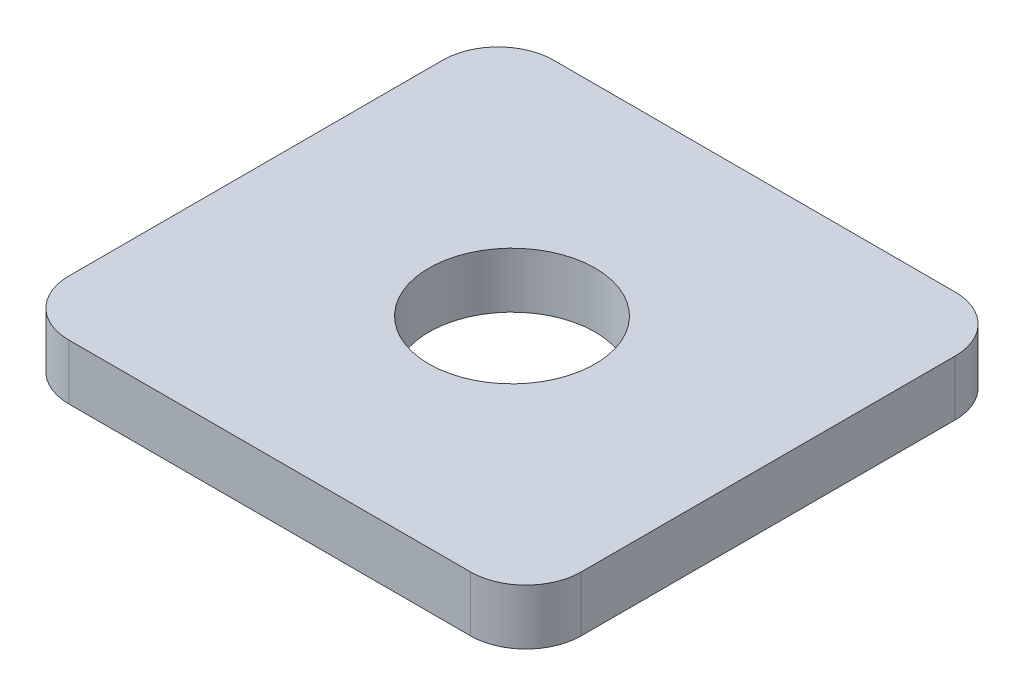
ISO-10303-21;
HEADER;
FILE_DESCRIPTION(('STEP AP214'),'2;1');
FILE_NAME('part.step','',(''),(''),'','','');
FILE_SCHEMA(('AUTOMOTIVE_DESIGN { 1 0 10303 214 1 1 1 1 }'));
ENDSEC;
DATA;
#1=APPLICATION_CONTEXT('core data for automotive mechanical design processes');
#2=APPLICATION_PROTOCOL_DEFINITION('international standard','automotive_design',2000,#1);
#3=PRODUCT_CONTEXT('',#1,'mechanical');
#4=PRODUCT('Part','Part','',(#3));
#5=PRODUCT_RELATED_PRODUCT_CATEGORY('part','',(#4));
#6=PRODUCT_DEFINITION_FORMATION('','',#4);
#7=PRODUCT_DEFINITION_CONTEXT('part definition',#1,'design');
#8=PRODUCT_DEFINITION('design','',#6,#7);
#9=PRODUCT_DEFINITION_SHAPE('','',#8);
#10=(LENGTH_UNIT() NAMED_UNIT(*) SI_UNIT(.MILLI.,.METRE.));
#11=(NAMED_UNIT(*) PLANE_ANGLE_UNIT() SI_UNIT($,.RADIAN.));
#12=(NAMED_UNIT(*) SI_UNIT($,.STERADIAN.) SOLID_ANGLE_UNIT());
#13=UNCERTAINTY_MEASURE_WITH_UNIT(LENGTH_MEASURE(1.E-05),#10,'distance_accuracy_value','');
#14=(GEOMETRIC_REPRESENTATION_CONTEXT(3) GLOBAL_UNCERTAINTY_ASSIGNED_CONTEXT((#13)) GLOBAL_UNIT_ASSIGNED_CONTEXT((#10,
#11,#12)) REPRESENTATION_CONTEXT('',''));
#15=CARTESIAN_POINT('',(0.,0.,0.));
#16=DIRECTION('',(0.,0.,1.));
#17=DIRECTION('',(1.,0.,0.));
#18=AXIS2_PLACEMENT_3D('',#15,#16,#17);
#19=CARTESIAN_POINT('',(9.25,2.,8.75));
#20=DIRECTION('',(-1.,0.,0.));
#21=DIRECTION('',(0.,0.,1.));
#22=AXIS2_PLACEMENT_3D('',#19,#20,#21);
#23=PLANE('',#22);
#24=DIRECTION('',(0.,0.,-1.));
#25=VECTOR('',#24,1.);
#26=CARTESIAN_POINT('',(9.25,0.,8.75));
#27=LINE('',#26,#25);
#28=CARTESIAN_POINT('',(9.25,0.,6.75));
#29=VERTEX_POINT('',#28);
#30=CARTESIAN_POINT('',(9.25,0.,-6.75));
#31=VERTEX_POINT('',#30);
#32=EDGE_CURVE('E141',#29,#31,#27,.T.);
#33=ORIENTED_EDGE('',*,*,#32,.T.);
#34=DIRECTION('',(0.,-1.,0.));
#35=VECTOR('',#34,1.);
#36=CARTESIAN_POINT('',(9.25,2.,-6.75));
#37=LINE('',#36,#35);
#38=CARTESIAN_POINT('',(9.25,2.,-6.75));
#39=VERTEX_POINT('',#38);
#40=EDGE_CURVE('E175',#31,#39,#37,.F.);
#41=ORIENTED_EDGE('',*,*,#40,.T.);
#42=DIRECTION('',(0.,0.,-1.));
#43=VECTOR('',#42,1.);
#44=CARTESIAN_POINT('',(9.25,2.,8.75));
#45=LINE('',#44,#43);
#46=CARTESIAN_POINT('',(9.25,2.,6.75));
#47=VERTEX_POINT('',#46);
#48=EDGE_CURVE('E139',#47,#39,#45,.T.);
#49=ORIENTED_EDGE('',*,*,#48,.F.);
#50=DIRECTION('',(0.,-1.,0.));
#51=VECTOR('',#50,1.);
#52=CARTESIAN_POINT('',(9.25,2.,6.75));
#53=LINE('',#52,#51);
#54=EDGE_CURVE('E171',#47,#29,#53,.T.);
#55=ORIENTED_EDGE('',*,*,#54,.T.);
#56=EDGE_LOOP('',(#33,#41,#49,#55));
#57=FACE_BOUND('',#56,.T.);
#58=ADVANCED_FACE('F39',(#57),#23,.F.);
#59=CARTESIAN_POINT('',(-9.25,2.,-8.75));
#60=DIRECTION('',(0.,0.,1.));
#61=DIRECTION('',(1.,0.,0.));
#62=AXIS2_PLACEMENT_3D('',#59,#60,#61);
#63=PLANE('',#62);
#64=DIRECTION('',(-1.,0.,0.));
#65=VECTOR('',#64,1.);
#66=CARTESIAN_POINT('',(-9.25,0.,-8.75));
#67=LINE('',#66,#65);
#68=CARTESIAN_POINT('',(7.25,0.,-8.75));
#69=VERTEX_POINT('',#68);
#70=CARTESIAN_POINT('',(-7.25,0.,-8.75));
#71=VERTEX_POINT('',#70);
#72=EDGE_CURVE('E135',#69,#71,#67,.T.);
#73=ORIENTED_EDGE('',*,*,#72,.T.);
#74=DIRECTION('',(0.,-1.,0.));
#75=VECTOR('',#74,1.);
#76=CARTESIAN_POINT('',(-7.25,2.,-8.75));
#77=LINE('',#76,#75);
#78=CARTESIAN_POINT('',(-7.25,2.,-8.75));
#79=VERTEX_POINT('',#78);
#80=EDGE_CURVE('E111',#71,#79,#77,.F.);
#81=ORIENTED_EDGE('',*,*,#80,.T.);
#82=DIRECTION('',(-1.,0.,0.));
#83=VECTOR('',#82,1.);
#84=CARTESIAN_POINT('',(-9.25,2.,-8.75));
#85=LINE('',#84,#83);
#86=CARTESIAN_POINT('',(7.25,2.,-8.75));
#87=VERTEX_POINT('',#86);
#88=EDGE_CURVE('E195',#87,#79,#85,.T.);
#89=ORIENTED_EDGE('',*,*,#88,.F.);
#90=DIRECTION('',(0.,-1.,0.));
#91=VECTOR('',#90,1.);
#92=CARTESIAN_POINT('',(7.25,2.,-8.75));
#93=LINE('',#92,#91);
#94=EDGE_CURVE('E117',#87,#69,#93,.T.);
#95=ORIENTED_EDGE('',*,*,#94,.T.);
#96=EDGE_LOOP('',(#73,#81,#89,#95));
#97=FACE_BOUND('',#96,.T.);
#98=ADVANCED_FACE('F223',(#97),#63,.F.);
#99=CARTESIAN_POINT('',(-9.25,2.,8.75));
#100=DIRECTION('',(1.,0.,0.));
#101=DIRECTION('',(0.,0.,-1.));
#102=AXIS2_PLACEMENT_3D('',#99,#100,#101);
#103=PLANE('',#102);
#104=DIRECTION('',(0.,0.,1.));
#105=VECTOR('',#104,1.);
#106=CARTESIAN_POINT('',(-9.25,2.,8.75));
#107=LINE('',#106,#105);
#108=CARTESIAN_POINT('',(-9.25,2.,-6.75));
#109=VERTEX_POINT('',#108);
#110=CARTESIAN_POINT('',(-9.25,2.,6.75));
#111=VERTEX_POINT('',#110);
#112=EDGE_CURVE('E126',#109,#111,#107,.T.);
#113=ORIENTED_EDGE('',*,*,#112,.F.);
#114=DIRECTION('',(0.,-1.,0.));
#115=VECTOR('',#114,1.);
#116=CARTESIAN_POINT('',(-9.25,2.,-6.75));
#117=LINE('',#116,#115);
#118=CARTESIAN_POINT('',(-9.25,0.,-6.75));
#119=VERTEX_POINT('',#118);
#120=EDGE_CURVE('E110',#109,#119,#117,.T.);
#121=ORIENTED_EDGE('',*,*,#120,.T.);
#122=DIRECTION('',(0.,0.,1.));
#123=VECTOR('',#122,1.);
#124=CARTESIAN_POINT('',(-9.25,0.,8.75));
#125=LINE('',#124,#123);
#126=CARTESIAN_POINT('',(-9.25,0.,6.75));
#127=VERTEX_POINT('',#126);
#128=EDGE_CURVE('E124',#119,#127,#125,.T.);
#129=ORIENTED_EDGE('',*,*,#128,.T.);
#130=DIRECTION('',(0.,-1.,0.));
#131=VECTOR('',#130,1.);
#132=CARTESIAN_POINT('',(-9.25,2.,6.75));
#133=LINE('',#132,#131);
#134=EDGE_CURVE('E129',#127,#111,#133,.F.);
#135=ORIENTED_EDGE('',*,*,#134,.T.);
#136=EDGE_LOOP('',(#113,#121,#129,#135));
#137=FACE_BOUND('',#136,.T.);
#138=ADVANCED_FACE('F123',(#137),#103,.F.);
#139=CARTESIAN_POINT('',(-9.25,2.,8.75));
#140=DIRECTION('',(0.,0.,-1.));
#141=DIRECTION('',(-1.,0.,0.));
#142=AXIS2_PLACEMENT_3D('',#139,#140,#141);
#143=PLANE('',#142);
#144=DIRECTION('',(1.,0.,0.));
#145=VECTOR('',#144,1.);
#146=CARTESIAN_POINT('',(-9.25,0.,8.75));
#147=LINE('',#146,#145);
#148=CARTESIAN_POINT('',(-7.25,0.,8.75));
#149=VERTEX_POINT('',#148);
#150=CARTESIAN_POINT('',(7.25,0.,8.75));
#151=VERTEX_POINT('',#150);
#152=EDGE_CURVE('E134',#149,#151,#147,.T.);
#153=ORIENTED_EDGE('',*,*,#152,.T.);
#154=DIRECTION('',(0.,-1.,0.));
#155=VECTOR('',#154,1.);
#156=CARTESIAN_POINT('',(7.25,2.,8.75));
#157=LINE('',#156,#155);
#158=CARTESIAN_POINT('',(7.25,2.,8.75));
#159=VERTEX_POINT('',#158);
#160=EDGE_CURVE('E11',#151,#159,#157,.F.);
#161=ORIENTED_EDGE('',*,*,#160,.T.);
#162=DIRECTION('',(1.,0.,0.));
#163=VECTOR('',#162,1.);
#164=CARTESIAN_POINT('',(-9.25,2.,8.75));
#165=LINE('',#164,#163);
#166=CARTESIAN_POINT('',(-7.25,2.,8.75));
#167=VERTEX_POINT('',#166);
#168=EDGE_CURVE('E146',#167,#159,#165,.T.);
#169=ORIENTED_EDGE('',*,*,#168,.F.);
#170=DIRECTION('',(0.,-1.,0.));
#171=VECTOR('',#170,1.);
#172=CARTESIAN_POINT('',(-7.25,2.,8.75));
#173=LINE('',#172,#171);
#174=EDGE_CURVE('E49',#167,#149,#173,.T.);
#175=ORIENTED_EDGE('',*,*,#174,.T.);
#176=EDGE_LOOP('',(#153,#161,#169,#175));
#177=FACE_BOUND('',#176,.T.);
#178=ADVANCED_FACE('F181',(#177),#143,.F.);
#179=CARTESIAN_POINT('',(0.,2.,0.));
#180=DIRECTION('',(0.,-1.,0.));
#181=DIRECTION('',(0.,0.,-1.));
#182=AXIS2_PLACEMENT_3D('',#179,#180,#181);
#183=PLANE('',#182);
#184=CARTESIAN_POINT('',(0.,2.,0.));
#185=DIRECTION('',(0.,1.,0.));
#186=DIRECTION('',(0.,0.,1.));
#187=AXIS2_PLACEMENT_3D('',#184,#185,#186);
#188=CIRCLE('',#187,3.);
#189=CARTESIAN_POINT('',(0.,2.,3.));
#190=VERTEX_POINT('',#189);
#191=EDGE_CURVE('E201',#190,#190,#188,.T.);
#192=ORIENTED_EDGE('',*,*,#191,.F.);
#193=EDGE_LOOP('',(#192));
#194=FACE_BOUND('',#193,.T.);
#195=ORIENTED_EDGE('',*,*,#88,.T.);
#196=CARTESIAN_POINT('',(-7.25,2.,-6.75));
#197=DIRECTION('',(0.,-1.,0.));
#198=DIRECTION('',(0.,0.,-1.));
#199=AXIS2_PLACEMENT_3D('',#196,#197,#198);
#200=CIRCLE('',#199,2.);
#201=EDGE_CURVE('E168',#79,#109,#200,.F.);
#202=ORIENTED_EDGE('',*,*,#201,.T.);
#203=ORIENTED_EDGE('',*,*,#112,.T.);
#204=CARTESIAN_POINT('',(-7.25,2.,6.75));
#205=DIRECTION('',(0.,-1.,0.));
#206=DIRECTION('',(0.,0.,-1.));
#207=AXIS2_PLACEMENT_3D('',#204,#205,#206);
#208=CIRCLE('',#207,2.);
#209=EDGE_CURVE('E61',#111,#167,#208,.F.);
#210=ORIENTED_EDGE('',*,*,#209,.T.);
#211=ORIENTED_EDGE('',*,*,#168,.T.);
#212=CARTESIAN_POINT('',(7.25,2.,6.75));
#213=DIRECTION('',(0.,-1.,0.));
#214=DIRECTION('',(0.,0.,-1.));
#215=AXIS2_PLACEMENT_3D('',#212,#213,#214);
#216=CIRCLE('',#215,2.);
#217=EDGE_CURVE('E162',#159,#47,#216,.F.);
#218=ORIENTED_EDGE('',*,*,#217,.T.);
#219=ORIENTED_EDGE('',*,*,#48,.T.);
#220=CARTESIAN_POINT('',(7.25,2.,-6.75));
#221=DIRECTION('',(0.,-1.,0.));
#222=DIRECTION('',(0.,0.,-1.));
#223=AXIS2_PLACEMENT_3D('',#220,#221,#222);
#224=CIRCLE('',#223,2.);
#225=EDGE_CURVE('E165',#39,#87,#224,.F.);
#226=ORIENTED_EDGE('',*,*,#225,.T.);
#227=EDGE_LOOP('',(#195,#202,#203,#210,#211,#218,#219,#226));
#228=FACE_BOUND('',#227,.T.);
#229=ADVANCED_FACE('F217',(#194,#228),#183,.F.);
#230=CARTESIAN_POINT('',(0.,0.,0.));
#231=DIRECTION('',(0.,-1.,0.));
#232=DIRECTION('',(0.,0.,-1.));
#233=AXIS2_PLACEMENT_3D('',#230,#231,#232);
#234=PLANE('',#233);
#235=CARTESIAN_POINT('',(0.,0.,0.));
#236=DIRECTION('',(0.,-1.,0.));
#237=DIRECTION('',(0.,0.,-1.));
#238=AXIS2_PLACEMENT_3D('',#235,#236,#237);
#239=CIRCLE('',#238,3.);
#240=CARTESIAN_POINT('',(0.,0.,-3.));
#241=VERTEX_POINT('',#240);
#242=EDGE_CURVE('E43',#241,#241,#239,.T.);
#243=ORIENTED_EDGE('',*,*,#242,.F.);
#244=EDGE_LOOP('',(#243));
#245=FACE_BOUND('',#244,.T.);
#246=ORIENTED_EDGE('',*,*,#128,.F.);
#247=CARTESIAN_POINT('',(-7.25,0.,-6.75));
#248=DIRECTION('',(0.,-1.,0.));
#249=DIRECTION('',(0.,0.,-1.));
#250=AXIS2_PLACEMENT_3D('',#247,#248,#249);
#251=CIRCLE('',#250,2.);
#252=EDGE_CURVE('E106',#119,#71,#251,.T.);
#253=ORIENTED_EDGE('',*,*,#252,.T.);
#254=ORIENTED_EDGE('',*,*,#72,.F.);
#255=CARTESIAN_POINT('',(7.25,0.,-6.75));
#256=DIRECTION('',(0.,-1.,0.));
#257=DIRECTION('',(0.,0.,-1.));
#258=AXIS2_PLACEMENT_3D('',#255,#256,#257);
#259=CIRCLE('',#258,2.);
#260=EDGE_CURVE('E118',#69,#31,#259,.T.);
#261=ORIENTED_EDGE('',*,*,#260,.T.);
#262=ORIENTED_EDGE('',*,*,#32,.F.);
#263=CARTESIAN_POINT('',(7.25,0.,6.75));
#264=DIRECTION('',(0.,-1.,0.));
#265=DIRECTION('',(0.,0.,-1.));
#266=AXIS2_PLACEMENT_3D('',#263,#264,#265);
#267=CIRCLE('',#266,2.);
#268=EDGE_CURVE('E150',#29,#151,#267,.T.);
#269=ORIENTED_EDGE('',*,*,#268,.T.);
#270=ORIENTED_EDGE('',*,*,#152,.F.);
#271=CARTESIAN_POINT('',(-7.25,0.,6.75));
#272=DIRECTION('',(0.,-1.,0.));
#273=DIRECTION('',(0.,0.,-1.));
#274=AXIS2_PLACEMENT_3D('',#271,#272,#273);
#275=CIRCLE('',#274,2.);
#276=EDGE_CURVE('E128',#149,#127,#275,.T.);
#277=ORIENTED_EDGE('',*,*,#276,.T.);
#278=EDGE_LOOP('',(#246,#253,#254,#261,#262,#269,#270,#277));
#279=FACE_BOUND('',#278,.T.);
#280=ADVANCED_FACE('F131',(#245,#279),#234,.T.);
#281=CARTESIAN_POINT('',(-7.25,2.,-6.75));
#282=DIRECTION('',(0.,-1.,0.));
#283=DIRECTION('',(0.,0.,-1.));
#284=AXIS2_PLACEMENT_3D('',#281,#282,#283);
#285=CYLINDRICAL_SURFACE('',#284,2.);
#286=ORIENTED_EDGE('',*,*,#201,.F.);
#287=ORIENTED_EDGE('',*,*,#80,.F.);
#288=ORIENTED_EDGE('',*,*,#252,.F.);
#289=ORIENTED_EDGE('',*,*,#120,.F.);
#290=EDGE_LOOP('',(#286,#287,#288,#289));
#291=FACE_BOUND('',#290,.T.);
#292=ADVANCED_FACE('F109',(#291),#285,.T.);
#293=CARTESIAN_POINT('',(7.25,2.,-6.75));
#294=DIRECTION('',(0.,-1.,0.));
#295=DIRECTION('',(0.,0.,-1.));
#296=AXIS2_PLACEMENT_3D('',#293,#294,#295);
#297=CYLINDRICAL_SURFACE('',#296,2.);
#298=ORIENTED_EDGE('',*,*,#225,.F.);
#299=ORIENTED_EDGE('',*,*,#40,.F.);
#300=ORIENTED_EDGE('',*,*,#260,.F.);
#301=ORIENTED_EDGE('',*,*,#94,.F.);
#302=EDGE_LOOP('',(#298,#299,#300,#301));
#303=FACE_BOUND('',#302,.T.);
#304=ADVANCED_FACE('F225',(#303),#297,.T.);
#305=CARTESIAN_POINT('',(7.25,2.,6.75));
#306=DIRECTION('',(0.,-1.,0.));
#307=DIRECTION('',(0.,0.,-1.));
#308=AXIS2_PLACEMENT_3D('',#305,#306,#307);
#309=CYLINDRICAL_SURFACE('',#308,2.);
#310=ORIENTED_EDGE('',*,*,#217,.F.);
#311=ORIENTED_EDGE('',*,*,#160,.F.);
#312=ORIENTED_EDGE('',*,*,#268,.F.);
#313=ORIENTED_EDGE('',*,*,#54,.F.);
#314=EDGE_LOOP('',(#310,#311,#312,#313));
#315=FACE_BOUND('',#314,.T.);
#316=ADVANCED_FACE('F188',(#315),#309,.T.);
#317=CARTESIAN_POINT('',(-7.25,2.,6.75));
#318=DIRECTION('',(0.,-1.,0.));
#319=DIRECTION('',(0.,0.,-1.));
#320=AXIS2_PLACEMENT_3D('',#317,#318,#319);
#321=CYLINDRICAL_SURFACE('',#320,2.);
#322=ORIENTED_EDGE('',*,*,#209,.F.);
#323=ORIENTED_EDGE('',*,*,#134,.F.);
#324=ORIENTED_EDGE('',*,*,#276,.F.);
#325=ORIENTED_EDGE('',*,*,#174,.F.);
#326=EDGE_LOOP('',(#322,#323,#324,#325));
#327=FACE_BOUND('',#326,.T.);
#328=ADVANCED_FACE('F41',(#327),#321,.T.);
#329=CARTESIAN_POINT('',(0.,-8.,0.));
#330=DIRECTION('',(0.,1.,0.));
#331=DIRECTION('',(0.,0.,1.));
#332=AXIS2_PLACEMENT_3D('',#329,#330,#331);
#333=CYLINDRICAL_SURFACE('',#332,3.);
#334=ORIENTED_EDGE('',*,*,#242,.T.);
#335=EDGE_LOOP('',(#334));
#336=FACE_BOUND('',#335,.T.);
#337=ORIENTED_EDGE('',*,*,#191,.T.);
#338=EDGE_LOOP('',(#337));
#339=FACE_BOUND('',#338,.T.);
#340=ADVANCED_FACE('F215',(#336,#339),#333,.F.);
#341=CLOSED_SHELL('',(#58,#98,#138,#178,#229,#280,#292,#304,#316,#328,#340));
#342=MANIFOLD_SOLID_BREP('B2',#341);
#343=ADVANCED_BREP_SHAPE_REPRESENTATION('',(#18,#342),#14);
#344=SHAPE_DEFINITION_REPRESENTATION(#9,#343);
ENDSEC;
END-ISO-10303-21;
